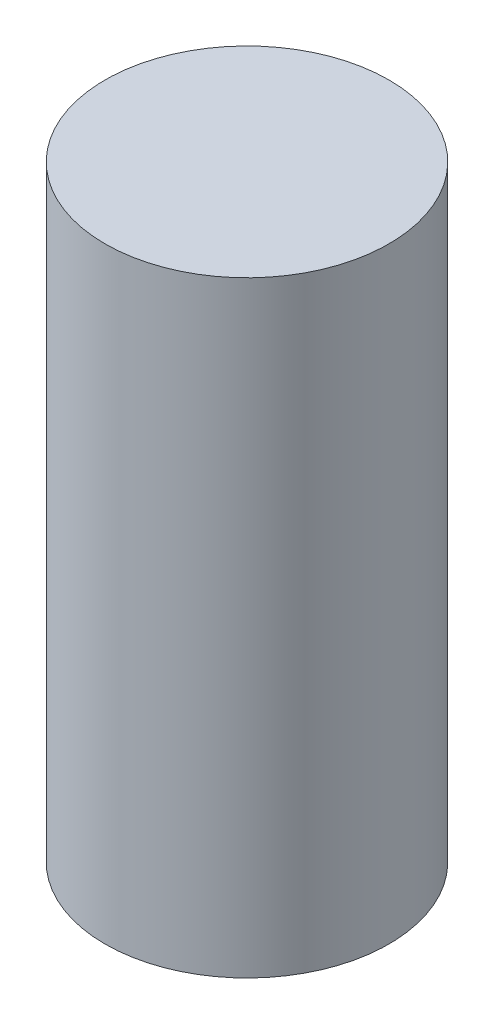
ISO-10303-21;
HEADER;
FILE_DESCRIPTION(('STEP AP214'),'2;1');
FILE_NAME('part.step','',(''),(''),'','','');
FILE_SCHEMA(('AUTOMOTIVE_DESIGN { 1 0 10303 214 1 1 1 1 }'));
ENDSEC;
DATA;
#1=APPLICATION_CONTEXT('core data for automotive mechanical design processes');
#2=APPLICATION_PROTOCOL_DEFINITION('international standard','automotive_design',2000,#1);
#3=PRODUCT_CONTEXT('',#1,'mechanical');
#4=PRODUCT('Part','Part','',(#3));
#5=PRODUCT_RELATED_PRODUCT_CATEGORY('part','',(#4));
#6=PRODUCT_DEFINITION_FORMATION('','',#4);
#7=PRODUCT_DEFINITION_CONTEXT('part definition',#1,'design');
#8=PRODUCT_DEFINITION('design','',#6,#7);
#9=PRODUCT_DEFINITION_SHAPE('','',#8);
#10=(LENGTH_UNIT() NAMED_UNIT(*) SI_UNIT(.MILLI.,.METRE.));
#11=(NAMED_UNIT(*) PLANE_ANGLE_UNIT() SI_UNIT($,.RADIAN.));
#12=(NAMED_UNIT(*) SI_UNIT($,.STERADIAN.) SOLID_ANGLE_UNIT());
#13=UNCERTAINTY_MEASURE_WITH_UNIT(LENGTH_MEASURE(1.E-05),#10,'distance_accuracy_value','');
#14=(GEOMETRIC_REPRESENTATION_CONTEXT(3) GLOBAL_UNCERTAINTY_ASSIGNED_CONTEXT((#13)) GLOBAL_UNIT_ASSIGNED_CONTEXT((#10,
#11,#12)) REPRESENTATION_CONTEXT('',''));
#15=CARTESIAN_POINT('',(0.,0.,0.));
#16=DIRECTION('',(0.,0.,1.));
#17=DIRECTION('',(1.,0.,0.));
#18=AXIS2_PLACEMENT_3D('',#15,#16,#17);
#19=CARTESIAN_POINT('',(138.316716,57.14365,27.935682));
#20=DIRECTION('',(0.,-1.,0.));
#21=DIRECTION('',(0.,0.,-1.));
#22=AXIS2_PLACEMENT_3D('',#19,#20,#21);
#23=CYLINDRICAL_SURFACE('',#22,13.3783341014477);
#24=CARTESIAN_POINT('',(138.316716,57.14365,27.935682));
#25=DIRECTION('',(0.,1.,0.));
#26=DIRECTION('',(0.,0.,1.));
#27=AXIS2_PLACEMENT_3D('',#24,#25,#26);
#28=CIRCLE('',#27,13.3783341014477);
#29=CARTESIAN_POINT('',(138.316716,57.14365,41.3140161014477));
#30=VERTEX_POINT('',#29);
#31=EDGE_CURVE('E10',#30,#30,#28,.T.);
#32=ORIENTED_EDGE('',*,*,#31,.F.);
#33=EDGE_LOOP('',(#32));
#34=FACE_BOUND('',#33,.T.);
#35=CARTESIAN_POINT('',(138.316716,0.,27.935682));
#36=DIRECTION('',(0.,1.,0.));
#37=DIRECTION('',(0.,0.,1.));
#38=AXIS2_PLACEMENT_3D('',#35,#36,#37);
#39=CIRCLE('',#38,13.3783341014477);
#40=CARTESIAN_POINT('',(138.316716,0.,41.3140161014477));
#41=VERTEX_POINT('',#40);
#42=EDGE_CURVE('E34',#41,#41,#39,.T.);
#43=ORIENTED_EDGE('',*,*,#42,.T.);
#44=EDGE_LOOP('',(#43));
#45=FACE_BOUND('',#44,.T.);
#46=ADVANCED_FACE('F31',(#34,#45),#23,.T.);
#47=CARTESIAN_POINT('',(138.316716,57.14365,27.935682));
#48=DIRECTION('',(0.,1.,0.));
#49=DIRECTION('',(0.,0.,1.));
#50=AXIS2_PLACEMENT_3D('',#47,#48,#49);
#51=PLANE('',#50);
#52=ORIENTED_EDGE('',*,*,#31,.T.);
#53=EDGE_LOOP('',(#52));
#54=FACE_BOUND('',#53,.T.);
#55=ADVANCED_FACE('F46',(#54),#51,.T.);
#56=CARTESIAN_POINT('',(138.316716,0.,27.935682));
#57=DIRECTION('',(0.,1.,0.));
#58=DIRECTION('',(0.,0.,1.));
#59=AXIS2_PLACEMENT_3D('',#56,#57,#58);
#60=PLANE('',#59);
#61=ORIENTED_EDGE('',*,*,#42,.F.);
#62=EDGE_LOOP('',(#61));
#63=FACE_BOUND('',#62,.T.);
#64=ADVANCED_FACE('F44',(#63),#60,.F.);
#65=CLOSED_SHELL('',(#46,#55,#64));
#66=MANIFOLD_SOLID_BREP('B2',#65);
#67=ADVANCED_BREP_SHAPE_REPRESENTATION('',(#18,#66),#14);
#68=SHAPE_DEFINITION_REPRESENTATION(#9,#67);
ENDSEC;
END-ISO-10303-21;
